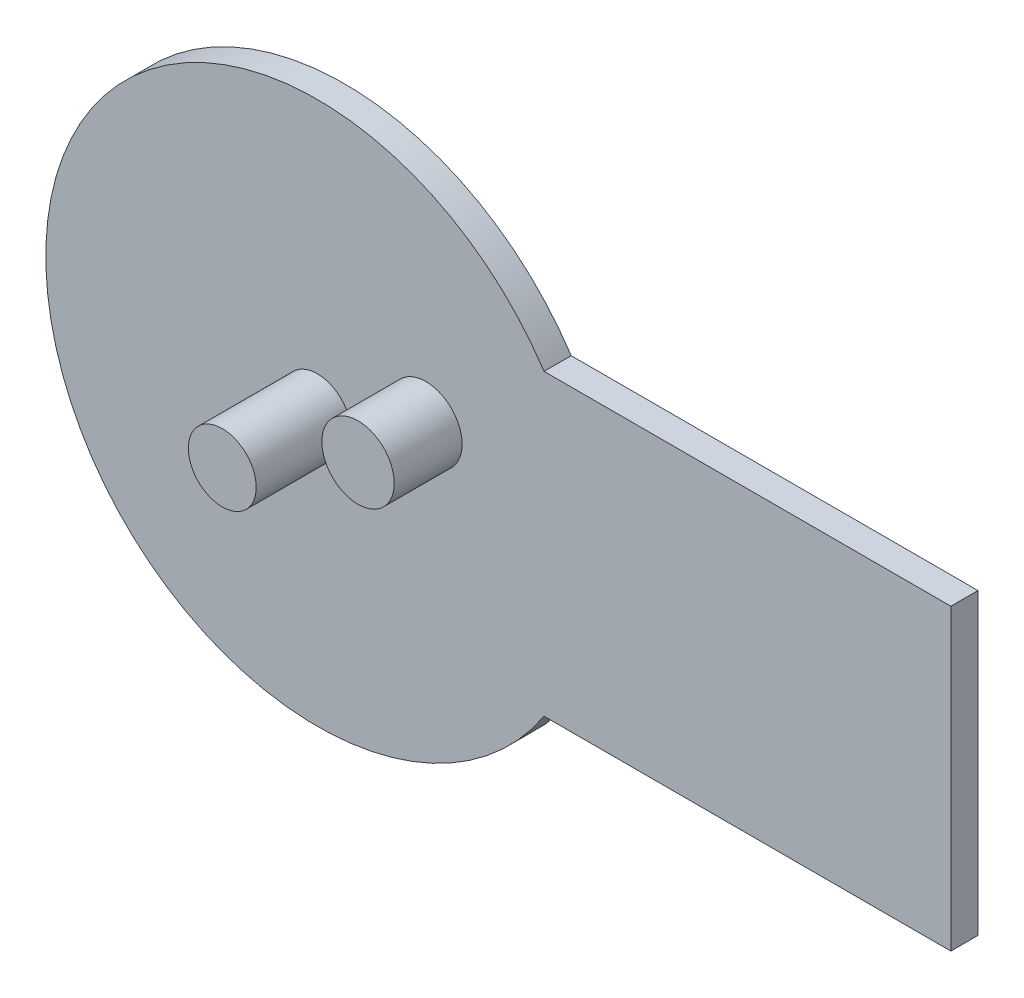
ISO-10303-21;
HEADER;
FILE_DESCRIPTION(('STEP AP214'),'2;1');
FILE_NAME('part.step','',(''),(''),'','','');
FILE_SCHEMA(('AUTOMOTIVE_DESIGN { 1 0 10303 214 1 1 1 1 }'));
ENDSEC;
DATA;
#1=APPLICATION_CONTEXT('core data for automotive mechanical design processes');
#2=APPLICATION_PROTOCOL_DEFINITION('international standard','automotive_design',2000,#1);
#3=PRODUCT_CONTEXT('',#1,'mechanical');
#4=PRODUCT('Part','Part','',(#3));
#5=PRODUCT_RELATED_PRODUCT_CATEGORY('part','',(#4));
#6=PRODUCT_DEFINITION_FORMATION('','',#4);
#7=PRODUCT_DEFINITION_CONTEXT('part definition',#1,'design');
#8=PRODUCT_DEFINITION('design','',#6,#7);
#9=PRODUCT_DEFINITION_SHAPE('','',#8);
#10=(LENGTH_UNIT() NAMED_UNIT(*) SI_UNIT(.MILLI.,.METRE.));
#11=(NAMED_UNIT(*) PLANE_ANGLE_UNIT() SI_UNIT($,.RADIAN.));
#12=(NAMED_UNIT(*) SI_UNIT($,.STERADIAN.) SOLID_ANGLE_UNIT());
#13=UNCERTAINTY_MEASURE_WITH_UNIT(LENGTH_MEASURE(1.E-05),#10,'distance_accuracy_value','');
#14=(GEOMETRIC_REPRESENTATION_CONTEXT(3) GLOBAL_UNCERTAINTY_ASSIGNED_CONTEXT((#13)) GLOBAL_UNIT_ASSIGNED_CONTEXT((#10,
#11,#12)) REPRESENTATION_CONTEXT('',''));
#15=CARTESIAN_POINT('',(0.,0.,0.));
#16=DIRECTION('',(0.,0.,1.));
#17=DIRECTION('',(1.,0.,0.));
#18=AXIS2_PLACEMENT_3D('',#15,#16,#17);
#19=CARTESIAN_POINT('',(0.,0.,3.));
#20=DIRECTION('',(0.,0.,-1.));
#21=DIRECTION('',(-1.,0.,0.));
#22=AXIS2_PLACEMENT_3D('',#19,#20,#21);
#23=CYLINDRICAL_SURFACE('',#22,30.);
#24=CARTESIAN_POINT('',(0.,0.,3.));
#25=DIRECTION('',(0.,0.,1.));
#26=DIRECTION('',(1.,0.,0.));
#27=AXIS2_PLACEMENT_3D('',#24,#25,#26);
#28=CIRCLE('',#27,30.);
#29=CARTESIAN_POINT('',(25.0549396327351,16.5,3.));
#30=VERTEX_POINT('',#29);
#31=CARTESIAN_POINT('',(25.0549396327351,-16.5,3.));
#32=VERTEX_POINT('',#31);
#33=EDGE_CURVE('E11',#30,#32,#28,.T.);
#34=ORIENTED_EDGE('',*,*,#33,.F.);
#35=DIRECTION('',(0.,0.,1.));
#36=VECTOR('',#35,1.);
#37=CARTESIAN_POINT('',(25.0549396327351,16.5,0.));
#38=LINE('',#37,#36);
#39=CARTESIAN_POINT('',(25.0549396327351,16.5,0.));
#40=VERTEX_POINT('',#39);
#41=EDGE_CURVE('E102',#40,#30,#38,.T.);
#42=ORIENTED_EDGE('',*,*,#41,.F.);
#43=CARTESIAN_POINT('',(0.,0.,0.));
#44=DIRECTION('',(0.,0.,1.));
#45=DIRECTION('',(1.,0.,0.));
#46=AXIS2_PLACEMENT_3D('',#43,#44,#45);
#47=CIRCLE('',#46,30.);
#48=CARTESIAN_POINT('',(25.0549396327351,-16.5,0.));
#49=VERTEX_POINT('',#48);
#50=EDGE_CURVE('E38',#40,#49,#47,.T.);
#51=ORIENTED_EDGE('',*,*,#50,.T.);
#52=DIRECTION('',(0.,0.,1.));
#53=VECTOR('',#52,1.);
#54=CARTESIAN_POINT('',(25.0549396327351,-16.5,0.));
#55=LINE('',#54,#53);
#56=EDGE_CURVE('E49',#49,#32,#55,.T.);
#57=ORIENTED_EDGE('',*,*,#56,.T.);
#58=EDGE_LOOP('',(#34,#42,#51,#57));
#59=FACE_BOUND('',#58,.T.);
#60=ADVANCED_FACE('F35',(#59),#23,.T.);
#61=CARTESIAN_POINT('',(0.,0.,3.));
#62=DIRECTION('',(0.,0.,1.));
#63=DIRECTION('',(1.,0.,0.));
#64=AXIS2_PLACEMENT_3D('',#61,#62,#63);
#65=PLANE('',#64);
#66=CARTESIAN_POINT('',(12.,5.,3.));
#67=DIRECTION('',(0.,0.,1.));
#68=DIRECTION('',(1.,0.,0.));
#69=AXIS2_PLACEMENT_3D('',#66,#67,#68);
#70=CIRCLE('',#69,4.);
#71=CARTESIAN_POINT('',(16.,5.,3.));
#72=VERTEX_POINT('',#71);
#73=EDGE_CURVE('E104',#72,#72,#70,.T.);
#74=ORIENTED_EDGE('',*,*,#73,.F.);
#75=EDGE_LOOP('',(#74));
#76=FACE_BOUND('',#75,.T.);
#77=CARTESIAN_POINT('',(0.,0.,3.));
#78=DIRECTION('',(0.,0.,1.));
#79=DIRECTION('',(1.,0.,0.));
#80=AXIS2_PLACEMENT_3D('',#77,#78,#79);
#81=CIRCLE('',#80,3.75);
#82=CARTESIAN_POINT('',(-3.75,0.,3.));
#83=VERTEX_POINT('',#82);
#84=EDGE_CURVE('E110',#83,#83,#81,.T.);
#85=ORIENTED_EDGE('',*,*,#84,.F.);
#86=EDGE_LOOP('',(#85));
#87=FACE_BOUND('',#86,.T.);
#88=ORIENTED_EDGE('',*,*,#33,.T.);
#89=DIRECTION('',(1.,0.,0.));
#90=VECTOR('',#89,1.);
#91=CARTESIAN_POINT('',(25.0549396327351,-16.5,3.));
#92=LINE('',#91,#90);
#93=CARTESIAN_POINT('',(70.,-16.5,3.));
#94=VERTEX_POINT('',#93);
#95=EDGE_CURVE('E99',#32,#94,#92,.T.);
#96=ORIENTED_EDGE('',*,*,#95,.T.);
#97=DIRECTION('',(0.,1.,0.));
#98=VECTOR('',#97,1.);
#99=CARTESIAN_POINT('',(70.,16.5,3.));
#100=LINE('',#99,#98);
#101=CARTESIAN_POINT('',(70.,16.5,3.));
#102=VERTEX_POINT('',#101);
#103=EDGE_CURVE('E78',#94,#102,#100,.T.);
#104=ORIENTED_EDGE('',*,*,#103,.T.);
#105=DIRECTION('',(-1.,0.,0.));
#106=VECTOR('',#105,1.);
#107=CARTESIAN_POINT('',(25.0549396327351,16.5,3.));
#108=LINE('',#107,#106);
#109=EDGE_CURVE('E93',#102,#30,#108,.T.);
#110=ORIENTED_EDGE('',*,*,#109,.T.);
#111=EDGE_LOOP('',(#88,#96,#104,#110));
#112=FACE_BOUND('',#111,.T.);
#113=ADVANCED_FACE('F121',(#76,#87,#112),#65,.T.);
#114=CARTESIAN_POINT('',(0.,0.,0.));
#115=DIRECTION('',(0.,0.,1.));
#116=DIRECTION('',(1.,0.,0.));
#117=AXIS2_PLACEMENT_3D('',#114,#115,#116);
#118=PLANE('',#117);
#119=ORIENTED_EDGE('',*,*,#50,.F.);
#120=DIRECTION('',(-1.,0.,0.));
#121=VECTOR('',#120,1.);
#122=CARTESIAN_POINT('',(25.0549396327351,16.5,0.));
#123=LINE('',#122,#121);
#124=CARTESIAN_POINT('',(70.,16.5,0.));
#125=VERTEX_POINT('',#124);
#126=EDGE_CURVE('E90',#125,#40,#123,.T.);
#127=ORIENTED_EDGE('',*,*,#126,.F.);
#128=DIRECTION('',(0.,1.,0.));
#129=VECTOR('',#128,1.);
#130=CARTESIAN_POINT('',(70.,16.5,0.));
#131=LINE('',#130,#129);
#132=CARTESIAN_POINT('',(70.,-16.5,0.));
#133=VERTEX_POINT('',#132);
#134=EDGE_CURVE('E75',#133,#125,#131,.T.);
#135=ORIENTED_EDGE('',*,*,#134,.F.);
#136=DIRECTION('',(1.,0.,0.));
#137=VECTOR('',#136,1.);
#138=CARTESIAN_POINT('',(25.0549396327351,-16.5,0.));
#139=LINE('',#138,#137);
#140=EDGE_CURVE('E88',#49,#133,#139,.T.);
#141=ORIENTED_EDGE('',*,*,#140,.F.);
#142=EDGE_LOOP('',(#119,#127,#135,#141));
#143=FACE_BOUND('',#142,.T.);
#144=ADVANCED_FACE('F87',(#143),#118,.F.);
#145=CARTESIAN_POINT('',(0.,0.,13.5));
#146=DIRECTION('',(0.,0.,-1.));
#147=DIRECTION('',(-1.,0.,0.));
#148=AXIS2_PLACEMENT_3D('',#145,#146,#147);
#149=CYLINDRICAL_SURFACE('',#148,3.75);
#150=CARTESIAN_POINT('',(0.,0.,13.5));
#151=DIRECTION('',(0.,0.,1.));
#152=DIRECTION('',(1.,0.,0.));
#153=AXIS2_PLACEMENT_3D('',#150,#151,#152);
#154=CIRCLE('',#153,3.75);
#155=CARTESIAN_POINT('',(-3.75,0.,13.5));
#156=VERTEX_POINT('',#155);
#157=EDGE_CURVE('E113',#156,#156,#154,.T.);
#158=CARTESIAN_POINT('',(-3.75,0.,13.5));
#159=CARTESIAN_POINT('',(-3.75,0.,13.390625));
#160=CARTESIAN_POINT('',(-3.75,0.,13.28125));
#161=CARTESIAN_POINT('',(-3.75,0.,13.0625));
#162=CARTESIAN_POINT('',(-3.75,0.,12.953125));
#163=CARTESIAN_POINT('',(-3.75,0.,12.734375));
#164=CARTESIAN_POINT('',(-3.75,0.,12.625));
#165=CARTESIAN_POINT('',(-3.75,0.,12.40625));
#166=CARTESIAN_POINT('',(-3.75,0.,12.296875));
#167=CARTESIAN_POINT('',(-3.75,0.,12.078125));
#168=CARTESIAN_POINT('',(-3.75,0.,11.96875));
#169=CARTESIAN_POINT('',(-3.75,0.,11.75));
#170=CARTESIAN_POINT('',(-3.75,0.,11.640625));
#171=CARTESIAN_POINT('',(-3.75,0.,11.421875));
#172=CARTESIAN_POINT('',(-3.75,0.,11.3125));
#173=CARTESIAN_POINT('',(-3.75,0.,11.09375));
#174=CARTESIAN_POINT('',(-3.75,0.,10.984375));
#175=CARTESIAN_POINT('',(-3.75,0.,10.765625));
#176=CARTESIAN_POINT('',(-3.75,0.,10.65625));
#177=CARTESIAN_POINT('',(-3.75,0.,10.4375));
#178=CARTESIAN_POINT('',(-3.75,0.,10.328125));
#179=CARTESIAN_POINT('',(-3.75,0.,10.109375));
#180=CARTESIAN_POINT('',(-3.75,0.,10.));
#181=CARTESIAN_POINT('',(-3.75,0.,9.78125));
#182=CARTESIAN_POINT('',(-3.75,0.,9.671875));
#183=CARTESIAN_POINT('',(-3.75,0.,9.453125));
#184=CARTESIAN_POINT('',(-3.75,0.,9.34375));
#185=CARTESIAN_POINT('',(-3.75,0.,9.125));
#186=CARTESIAN_POINT('',(-3.75,0.,9.015625));
#187=CARTESIAN_POINT('',(-3.75,0.,8.796875));
#188=CARTESIAN_POINT('',(-3.75,0.,8.6875));
#189=CARTESIAN_POINT('',(-3.75,0.,8.46875));
#190=CARTESIAN_POINT('',(-3.75,0.,8.359375));
#191=CARTESIAN_POINT('',(-3.75,0.,8.140625));
#192=CARTESIAN_POINT('',(-3.75,0.,8.03125));
#193=CARTESIAN_POINT('',(-3.75,0.,7.8125));
#194=CARTESIAN_POINT('',(-3.75,0.,7.703125));
#195=CARTESIAN_POINT('',(-3.75,0.,7.484375));
#196=CARTESIAN_POINT('',(-3.75,0.,7.375));
#197=CARTESIAN_POINT('',(-3.75,0.,7.15625));
#198=CARTESIAN_POINT('',(-3.75,0.,7.046875));
#199=CARTESIAN_POINT('',(-3.75,0.,6.828125));
#200=CARTESIAN_POINT('',(-3.75,0.,6.71875));
#201=CARTESIAN_POINT('',(-3.75,0.,6.5));
#202=CARTESIAN_POINT('',(-3.75,0.,6.390625));
#203=CARTESIAN_POINT('',(-3.75,0.,6.171875));
#204=CARTESIAN_POINT('',(-3.75,0.,6.0625));
#205=CARTESIAN_POINT('',(-3.75,0.,5.84375));
#206=CARTESIAN_POINT('',(-3.75,0.,5.734375));
#207=CARTESIAN_POINT('',(-3.75,0.,5.515625));
#208=CARTESIAN_POINT('',(-3.75,0.,5.40625));
#209=CARTESIAN_POINT('',(-3.75,0.,5.1875));
#210=CARTESIAN_POINT('',(-3.75,0.,5.078125));
#211=CARTESIAN_POINT('',(-3.75,0.,4.859375));
#212=CARTESIAN_POINT('',(-3.75,0.,4.75));
#213=CARTESIAN_POINT('',(-3.75,0.,4.53125));
#214=CARTESIAN_POINT('',(-3.75,0.,4.421875));
#215=CARTESIAN_POINT('',(-3.75,0.,4.203125));
#216=CARTESIAN_POINT('',(-3.75,0.,4.09375));
#217=CARTESIAN_POINT('',(-3.75,0.,3.875));
#218=CARTESIAN_POINT('',(-3.75,0.,3.765625));
#219=CARTESIAN_POINT('',(-3.75,0.,3.546875));
#220=CARTESIAN_POINT('',(-3.75,0.,3.4375));
#221=CARTESIAN_POINT('',(-3.75,0.,3.21875));
#222=CARTESIAN_POINT('',(-3.75,0.,3.109375));
#223=CARTESIAN_POINT('',(-3.75,0.,3.));
#224=B_SPLINE_CURVE_WITH_KNOTS('',3,(#158,#159,#160,#161,#162,#163,#164,#165,#166,#167,#168,
#169,#170,#171,#172,#173,#174,#175,#176,#177,#178,#179,#180,#181,#182,#183,#184,#185,#186,#187,
#188,#189,#190,#191,#192,#193,#194,#195,#196,#197,#198,#199,#200,#201,#202,#203,#204,#205,#206,
#207,#208,#209,#210,#211,#212,#213,#214,#215,#216,#217,#218,#219,#220,#221,#222,#223),
.UNSPECIFIED.,.F.,.F.,(4,2,2,2,2,2,2,2,2,2,2,2,2,2,2,2,2,2,2,2,2,2,2,2,2,2,2,2,2,2,2,2,4),(0.,
0.328124999999999,0.656249999999999,0.984374999999999,1.3125,1.640625,1.96875,2.296875,2.625,
2.953125,3.28125,3.609375,3.9375,4.265625,4.59375,4.921875,5.25,5.578125,5.90625,6.234375,
6.5625,6.890625,7.21875,7.546875,7.875,8.203125,8.53125,8.859375,9.1875,9.515625,9.84375,
10.171875,10.5),.UNSPECIFIED.);
#225=EDGE_CURVE('BSEAM119',#156,#83,#224,.T.);
#226=ORIENTED_EDGE('',*,*,#157,.F.);
#227=ORIENTED_EDGE('',*,*,#84,.T.);
#228=ORIENTED_EDGE('',*,*,#225,.T.);
#229=ORIENTED_EDGE('',*,*,#225,.F.);
#230=EDGE_LOOP('',(#226,#228,#227,#229));
#231=FACE_BOUND('',#230,.T.);
#232=ADVANCED_FACE('F119',(#231),#149,.T.);
#233=CARTESIAN_POINT('',(0.,0.,13.5));
#234=DIRECTION('',(0.,0.,1.));
#235=DIRECTION('',(1.,0.,0.));
#236=AXIS2_PLACEMENT_3D('',#233,#234,#235);
#237=PLANE('',#236);
#238=ORIENTED_EDGE('',*,*,#157,.T.);
#239=EDGE_LOOP('',(#238));
#240=FACE_BOUND('',#239,.T.);
#241=ADVANCED_FACE('F186',(#240),#237,.T.);
#242=CARTESIAN_POINT('',(12.,5.,10.5));
#243=DIRECTION('',(0.,0.,-1.));
#244=DIRECTION('',(-1.,0.,0.));
#245=AXIS2_PLACEMENT_3D('',#242,#243,#244);
#246=CYLINDRICAL_SURFACE('',#245,4.);
#247=CARTESIAN_POINT('',(12.,5.,10.5));
#248=DIRECTION('',(0.,0.,1.));
#249=DIRECTION('',(1.,0.,0.));
#250=AXIS2_PLACEMENT_3D('',#247,#248,#249);
#251=CIRCLE('',#250,4.);
#252=CARTESIAN_POINT('',(16.,5.,10.5));
#253=VERTEX_POINT('',#252);
#254=EDGE_CURVE('E107',#253,#253,#251,.T.);
#255=ORIENTED_EDGE('',*,*,#254,.F.);
#256=EDGE_LOOP('',(#255));
#257=FACE_BOUND('',#256,.T.);
#258=ORIENTED_EDGE('',*,*,#73,.T.);
#259=EDGE_LOOP('',(#258));
#260=FACE_BOUND('',#259,.T.);
#261=ADVANCED_FACE('F182',(#257,#260),#246,.T.);
#262=CARTESIAN_POINT('',(12.,5.,10.5));
#263=DIRECTION('',(0.,0.,1.));
#264=DIRECTION('',(1.,0.,0.));
#265=AXIS2_PLACEMENT_3D('',#262,#263,#264);
#266=PLANE('',#265);
#267=ORIENTED_EDGE('',*,*,#254,.T.);
#268=EDGE_LOOP('',(#267));
#269=FACE_BOUND('',#268,.T.);
#270=ADVANCED_FACE('F136',(#269),#266,.T.);
#271=CARTESIAN_POINT('',(25.0549396327351,16.5,0.));
#272=DIRECTION('',(0.,1.,0.));
#273=DIRECTION('',(0.,0.,1.));
#274=AXIS2_PLACEMENT_3D('',#271,#272,#273);
#275=PLANE('',#274);
#276=ORIENTED_EDGE('',*,*,#109,.F.);
#277=DIRECTION('',(0.,0.,1.));
#278=VECTOR('',#277,1.);
#279=CARTESIAN_POINT('',(70.,16.5,0.));
#280=LINE('',#279,#278);
#281=EDGE_CURVE('E83',#125,#102,#280,.T.);
#282=ORIENTED_EDGE('',*,*,#281,.F.);
#283=ORIENTED_EDGE('',*,*,#126,.T.);
#284=ORIENTED_EDGE('',*,*,#41,.T.);
#285=EDGE_LOOP('',(#276,#282,#283,#284));
#286=FACE_BOUND('',#285,.T.);
#287=ADVANCED_FACE('F128',(#286),#275,.T.);
#288=CARTESIAN_POINT('',(70.,16.5,0.));
#289=DIRECTION('',(1.,0.,0.));
#290=DIRECTION('',(0.,0.,-1.));
#291=AXIS2_PLACEMENT_3D('',#288,#289,#290);
#292=PLANE('',#291);
#293=ORIENTED_EDGE('',*,*,#103,.F.);
#294=DIRECTION('',(0.,0.,1.));
#295=VECTOR('',#294,1.);
#296=CARTESIAN_POINT('',(70.,-16.5,0.));
#297=LINE('',#296,#295);
#298=EDGE_CURVE('E72',#133,#94,#297,.T.);
#299=ORIENTED_EDGE('',*,*,#298,.F.);
#300=ORIENTED_EDGE('',*,*,#134,.T.);
#301=ORIENTED_EDGE('',*,*,#281,.T.);
#302=EDGE_LOOP('',(#293,#299,#300,#301));
#303=FACE_BOUND('',#302,.T.);
#304=ADVANCED_FACE('F74',(#303),#292,.T.);
#305=CARTESIAN_POINT('',(25.0549396327351,-16.5,0.));
#306=DIRECTION('',(0.,-1.,0.));
#307=DIRECTION('',(0.,0.,-1.));
#308=AXIS2_PLACEMENT_3D('',#305,#306,#307);
#309=PLANE('',#308);
#310=ORIENTED_EDGE('',*,*,#95,.F.);
#311=ORIENTED_EDGE('',*,*,#56,.F.);
#312=ORIENTED_EDGE('',*,*,#140,.T.);
#313=ORIENTED_EDGE('',*,*,#298,.T.);
#314=EDGE_LOOP('',(#310,#311,#312,#313));
#315=FACE_BOUND('',#314,.T.);
#316=ADVANCED_FACE('F92',(#315),#309,.T.);
#317=CLOSED_SHELL('',(#60,#113,#144,#232,#241,#261,#270,#287,#304,#316));
#318=MANIFOLD_SOLID_BREP('B2',#317);
#319=ADVANCED_BREP_SHAPE_REPRESENTATION('',(#18,#318),#14);
#320=SHAPE_DEFINITION_REPRESENTATION(#9,#319);
ENDSEC;
END-ISO-10303-21;
